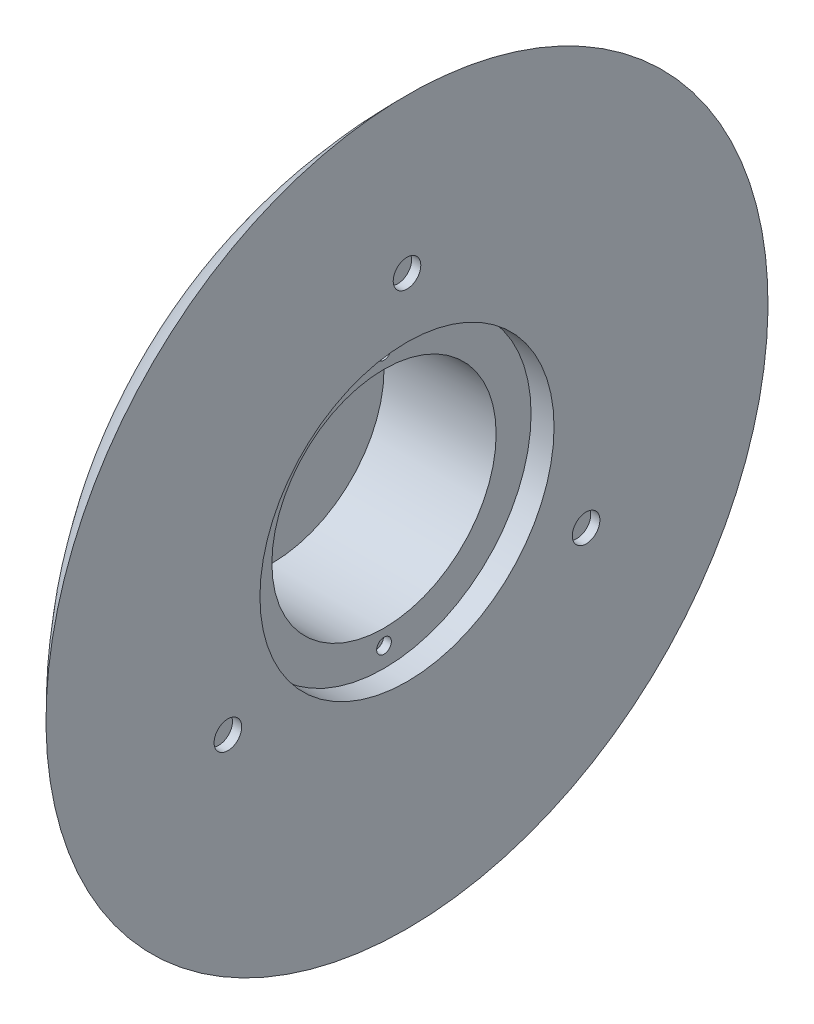
ISO-10303-21;
HEADER;
FILE_DESCRIPTION(('STEP AP214'),'2;1');
FILE_NAME('part.step','',(''),(''),'','','');
FILE_SCHEMA(('AUTOMOTIVE_DESIGN { 1 0 10303 214 1 1 1 1 }'));
ENDSEC;
DATA;
#1=APPLICATION_CONTEXT('core data for automotive mechanical design processes');
#2=APPLICATION_PROTOCOL_DEFINITION('international standard','automotive_design',2000,#1);
#3=PRODUCT_CONTEXT('',#1,'mechanical');
#4=PRODUCT('Part','Part','',(#3));
#5=PRODUCT_RELATED_PRODUCT_CATEGORY('part','',(#4));
#6=PRODUCT_DEFINITION_FORMATION('','',#4);
#7=PRODUCT_DEFINITION_CONTEXT('part definition',#1,'design');
#8=PRODUCT_DEFINITION('design','',#6,#7);
#9=PRODUCT_DEFINITION_SHAPE('','',#8);
#10=(LENGTH_UNIT() NAMED_UNIT(*) SI_UNIT(.MILLI.,.METRE.));
#11=(NAMED_UNIT(*) PLANE_ANGLE_UNIT() SI_UNIT($,.RADIAN.));
#12=(NAMED_UNIT(*) SI_UNIT($,.STERADIAN.) SOLID_ANGLE_UNIT());
#13=UNCERTAINTY_MEASURE_WITH_UNIT(LENGTH_MEASURE(1.E-05),#10,'distance_accuracy_value','');
#14=(GEOMETRIC_REPRESENTATION_CONTEXT(3) GLOBAL_UNCERTAINTY_ASSIGNED_CONTEXT((#13)) GLOBAL_UNIT_ASSIGNED_CONTEXT((#10,
#11,#12)) REPRESENTATION_CONTEXT('',''));
#15=CARTESIAN_POINT('',(0.,0.,0.));
#16=DIRECTION('',(0.,0.,1.));
#17=DIRECTION('',(1.,0.,0.));
#18=AXIS2_PLACEMENT_3D('',#15,#16,#17);
#19=CARTESIAN_POINT('',(-41.,0.,0.));
#20=DIRECTION('',(1.,0.,0.));
#21=DIRECTION('',(0.,1.,0.));
#22=AXIS2_PLACEMENT_3D('',#19,#20,#21);
#23=PLANE('',#22);
#24=CARTESIAN_POINT('',(-41.,0.,0.));
#25=DIRECTION('',(1.,0.,0.));
#26=DIRECTION('',(0.,1.,0.));
#27=AXIS2_PLACEMENT_3D('',#24,#25,#26);
#28=CIRCLE('',#27,12.2);
#29=CARTESIAN_POINT('',(-41.,12.2,0.));
#30=VERTEX_POINT('',#29);
#31=EDGE_CURVE('E53',#30,#30,#28,.F.);
#32=ORIENTED_EDGE('',*,*,#31,.T.);
#33=EDGE_LOOP('',(#32));
#34=FACE_BOUND('',#33,.T.);
#35=CARTESIAN_POINT('',(-41.,0.,0.));
#36=DIRECTION('',(1.,0.,0.));
#37=DIRECTION('',(0.,1.,0.));
#38=AXIS2_PLACEMENT_3D('',#35,#36,#37);
#39=CIRCLE('',#38,16.);
#40=CARTESIAN_POINT('',(-41.,16.,0.));
#41=VERTEX_POINT('',#40);
#42=EDGE_CURVE('E56',#41,#41,#39,.T.);
#43=ORIENTED_EDGE('',*,*,#42,.T.);
#44=EDGE_LOOP('',(#43));
#45=FACE_BOUND('',#44,.T.);
#46=CARTESIAN_POINT('',(-41.,-13.8504291713074,0.));
#47=DIRECTION('',(-1.,0.,0.));
#48=DIRECTION('',(0.,-1.,0.));
#49=AXIS2_PLACEMENT_3D('',#46,#47,#48);
#50=CIRCLE('',#49,0.8);
#51=CARTESIAN_POINT('',(-41.,-14.6504291713074,0.));
#52=VERTEX_POINT('',#51);
#53=EDGE_CURVE('E89',#52,#52,#50,.T.);
#54=ORIENTED_EDGE('',*,*,#53,.T.);
#55=EDGE_LOOP('',(#54));
#56=FACE_BOUND('',#55,.T.);
#57=CARTESIAN_POINT('',(-41.,13.8504291713074,0.));
#58=DIRECTION('',(1.,0.,0.));
#59=DIRECTION('',(0.,1.,0.));
#60=AXIS2_PLACEMENT_3D('',#57,#58,#59);
#61=CIRCLE('',#60,0.8);
#62=CARTESIAN_POINT('',(-41.,14.6504291713074,0.));
#63=VERTEX_POINT('',#62);
#64=EDGE_CURVE('E86',#63,#63,#61,.T.);
#65=ORIENTED_EDGE('',*,*,#64,.F.);
#66=EDGE_LOOP('',(#65));
#67=FACE_BOUND('',#66,.T.);
#68=ADVANCED_FACE('F35',(#34,#45,#56,#67),#23,.T.);
#69=CARTESIAN_POINT('',(-53.2,0.,0.));
#70=DIRECTION('',(1.,0.,0.));
#71=DIRECTION('',(0.,1.,0.));
#72=AXIS2_PLACEMENT_3D('',#69,#70,#71);
#73=CYLINDRICAL_SURFACE('',#72,12.2);
#74=CARTESIAN_POINT('',(-53.2,0.,0.));
#75=DIRECTION('',(1.,0.,0.));
#76=DIRECTION('',(0.,1.,0.));
#77=AXIS2_PLACEMENT_3D('',#74,#75,#76);
#78=CIRCLE('',#77,12.2);
#79=CARTESIAN_POINT('',(-53.2,12.2,0.));
#80=VERTEX_POINT('',#79);
#81=EDGE_CURVE('E50',#80,#80,#78,.T.);
#82=ORIENTED_EDGE('',*,*,#81,.F.);
#83=EDGE_LOOP('',(#82));
#84=FACE_BOUND('',#83,.T.);
#85=ORIENTED_EDGE('',*,*,#31,.F.);
#86=EDGE_LOOP('',(#85));
#87=FACE_BOUND('',#86,.T.);
#88=ADVANCED_FACE('F124',(#84,#87),#73,.F.);
#89=CARTESIAN_POINT('',(-53.2,0.,0.));
#90=DIRECTION('',(1.,0.,0.));
#91=DIRECTION('',(0.,1.,0.));
#92=AXIS2_PLACEMENT_3D('',#89,#90,#91);
#93=PLANE('',#92);
#94=CARTESIAN_POINT('',(-53.2,0.,0.));
#95=DIRECTION('',(1.,0.,0.));
#96=DIRECTION('',(0.,1.,0.));
#97=AXIS2_PLACEMENT_3D('',#94,#95,#96);
#98=CIRCLE('',#97,3.);
#99=CARTESIAN_POINT('',(-53.2,2.99999999999999,0.));
#100=VERTEX_POINT('',#99);
#101=EDGE_CURVE('E61',#100,#100,#98,.T.);
#102=ORIENTED_EDGE('',*,*,#101,.F.);
#103=EDGE_LOOP('',(#102));
#104=FACE_BOUND('',#103,.T.);
#105=ORIENTED_EDGE('',*,*,#81,.T.);
#106=EDGE_LOOP('',(#105));
#107=FACE_BOUND('',#106,.T.);
#108=ADVANCED_FACE('F132',(#104,#107),#93,.T.);
#109=CARTESIAN_POINT('',(-53.9,0.,0.));
#110=DIRECTION('',(1.,0.,0.));
#111=DIRECTION('',(0.,1.,0.));
#112=AXIS2_PLACEMENT_3D('',#109,#110,#111);
#113=CYLINDRICAL_SURFACE('',#112,3.);
#114=CARTESIAN_POINT('',(-53.9,0.,0.));
#115=DIRECTION('',(1.,0.,0.));
#116=DIRECTION('',(0.,1.,0.));
#117=AXIS2_PLACEMENT_3D('',#114,#115,#116);
#118=CIRCLE('',#117,3.);
#119=CARTESIAN_POINT('',(-53.9,2.99999999999999,0.));
#120=VERTEX_POINT('',#119);
#121=EDGE_CURVE('E60',#120,#120,#118,.T.);
#122=ORIENTED_EDGE('',*,*,#121,.F.);
#123=EDGE_LOOP('',(#122));
#124=FACE_BOUND('',#123,.T.);
#125=ORIENTED_EDGE('',*,*,#101,.T.);
#126=EDGE_LOOP('',(#125));
#127=FACE_BOUND('',#126,.T.);
#128=ADVANCED_FACE('F170',(#124,#127),#113,.F.);
#129=CARTESIAN_POINT('',(-53.9,0.,0.));
#130=DIRECTION('',(1.,0.,0.));
#131=DIRECTION('',(0.,1.,0.));
#132=AXIS2_PLACEMENT_3D('',#129,#130,#131);
#133=PLANE('',#132);
#134=ORIENTED_EDGE('',*,*,#121,.T.);
#135=EDGE_LOOP('',(#134));
#136=FACE_BOUND('',#135,.T.);
#137=ADVANCED_FACE('F142',(#136),#133,.T.);
#138=CARTESIAN_POINT('',(-41.,0.,0.));
#139=DIRECTION('',(1.,0.,0.));
#140=DIRECTION('',(0.,1.,0.));
#141=AXIS2_PLACEMENT_3D('',#138,#139,#140);
#142=CYLINDRICAL_SURFACE('',#141,16.);
#143=ORIENTED_EDGE('',*,*,#42,.F.);
#144=EDGE_LOOP('',(#143));
#145=FACE_BOUND('',#144,.T.);
#146=CARTESIAN_POINT('',(-38.5,0.,0.));
#147=DIRECTION('',(1.,0.,0.));
#148=DIRECTION('',(0.,1.,0.));
#149=AXIS2_PLACEMENT_3D('',#146,#147,#148);
#150=CIRCLE('',#149,16.);
#151=CARTESIAN_POINT('',(-38.5,16.,0.));
#152=VERTEX_POINT('',#151);
#153=EDGE_CURVE('E83',#152,#152,#150,.T.);
#154=ORIENTED_EDGE('',*,*,#153,.T.);
#155=EDGE_LOOP('',(#154));
#156=FACE_BOUND('',#155,.T.);
#157=ADVANCED_FACE('F138',(#145,#156),#142,.F.);
#158=CARTESIAN_POINT('',(-39.5,22.5,0.));
#159=DIRECTION('',(1.,0.,0.));
#160=DIRECTION('',(0.,1.,0.));
#161=AXIS2_PLACEMENT_3D('',#158,#159,#160);
#162=PLANE('',#161);
#163=CARTESIAN_POINT('',(-39.5,22.5,0.));
#164=DIRECTION('',(1.,0.,0.));
#165=DIRECTION('',(0.,1.,0.));
#166=AXIS2_PLACEMENT_3D('',#163,#164,#165);
#167=CIRCLE('',#166,1.5);
#168=CARTESIAN_POINT('',(-39.5,24.,0.));
#169=VERTEX_POINT('',#168);
#170=EDGE_CURVE('E75',#169,#169,#167,.T.);
#171=ORIENTED_EDGE('',*,*,#170,.T.);
#172=EDGE_LOOP('',(#171));
#173=FACE_BOUND('',#172,.T.);
#174=ADVANCED_FACE('F141',(#173),#162,.T.);
#175=CARTESIAN_POINT('',(-39.5,-11.2499999999992,-19.4855715851513));
#176=DIRECTION('',(1.,0.,0.));
#177=DIRECTION('',(0.,1.,0.));
#178=AXIS2_PLACEMENT_3D('',#175,#176,#177);
#179=PLANE('',#178);
#180=CARTESIAN_POINT('',(-39.5,-11.2499999999992,-19.4855715851513));
#181=DIRECTION('',(1.,0.,0.));
#182=DIRECTION('',(0.,1.,0.));
#183=AXIS2_PLACEMENT_3D('',#180,#181,#182);
#184=CIRCLE('',#183,1.50000000000123);
#185=CARTESIAN_POINT('',(-39.5,-9.74999999999794,-19.4855715851513));
#186=VERTEX_POINT('',#185);
#187=EDGE_CURVE('E55',#186,#186,#184,.T.);
#188=ORIENTED_EDGE('',*,*,#187,.T.);
#189=EDGE_LOOP('',(#188));
#190=FACE_BOUND('',#189,.T.);
#191=ADVANCED_FACE('F146',(#190),#179,.T.);
#192=CARTESIAN_POINT('',(-39.5,-11.2500000000008,19.4855715851484));
#193=DIRECTION('',(1.,0.,0.));
#194=DIRECTION('',(0.,1.,0.));
#195=AXIS2_PLACEMENT_3D('',#192,#193,#194);
#196=PLANE('',#195);
#197=CARTESIAN_POINT('',(-39.5,-11.2500000000008,19.4855715851484));
#198=DIRECTION('',(1.,0.,0.));
#199=DIRECTION('',(0.,1.,0.));
#200=AXIS2_PLACEMENT_3D('',#197,#198,#199);
#201=CIRCLE('',#200,1.50000000000183);
#202=CARTESIAN_POINT('',(-39.5,-9.74999999999901,19.4855715851484));
#203=VERTEX_POINT('',#202);
#204=EDGE_CURVE('E78',#203,#203,#201,.T.);
#205=ORIENTED_EDGE('',*,*,#204,.T.);
#206=EDGE_LOOP('',(#205));
#207=FACE_BOUND('',#206,.T.);
#208=ADVANCED_FACE('F153',(#207),#196,.T.);
#209=CARTESIAN_POINT('',(0.,0.,0.));
#210=DIRECTION('',(0.,1.,0.));
#211=DIRECTION('',(1.,0.,0.));
#212=AXIS2_PLACEMENT_3D('',#209,#210,#211);
#213=SPHERICAL_SURFACE('',#212,55.);
#214=CARTESIAN_POINT('',(0.,0.,0.));
#215=DIRECTION('',(-1.,0.,0.));
#216=DIRECTION('',(0.,-1.,0.));
#217=AXIS2_PLACEMENT_3D('',#214,#215,#216);
#218=SPHERICAL_SURFACE('',#217,55.);
#219=CARTESIAN_POINT('',(-38.5,0.,0.));
#220=DIRECTION('',(-1.,0.,0.));
#221=DIRECTION('',(0.,-1.,0.));
#222=AXIS2_PLACEMENT_3D('',#219,#220,#221);
#223=CIRCLE('',#222,39.2778563569857);
#224=CARTESIAN_POINT('',(-38.5,-39.2778563569857,0.));
#225=VERTEX_POINT('',#224);
#226=EDGE_CURVE('E46',#225,#225,#223,.F.);
#227=ORIENTED_EDGE('',*,*,#226,.F.);
#228=EDGE_LOOP('',(#227));
#229=FACE_BOUND('',#228,.T.);
#230=ADVANCED_FACE('F37',(#229),#218,.T.);
#231=CARTESIAN_POINT('',(-39.5,22.5,0.));
#232=DIRECTION('',(1.,0.,0.));
#233=DIRECTION('',(0.,1.,0.));
#234=AXIS2_PLACEMENT_3D('',#231,#232,#233);
#235=CYLINDRICAL_SURFACE('',#234,1.5);
#236=ORIENTED_EDGE('',*,*,#170,.F.);
#237=EDGE_LOOP('',(#236));
#238=FACE_BOUND('',#237,.T.);
#239=CARTESIAN_POINT('',(-38.5,22.5,0.));
#240=DIRECTION('',(-1.,0.,0.));
#241=DIRECTION('',(0.,-1.,0.));
#242=AXIS2_PLACEMENT_3D('',#239,#240,#241);
#243=CIRCLE('',#242,1.5);
#244=CARTESIAN_POINT('',(-38.5,21.,0.));
#245=VERTEX_POINT('',#244);
#246=EDGE_CURVE('E64',#245,#245,#243,.T.);
#247=ORIENTED_EDGE('',*,*,#246,.F.);
#248=EDGE_LOOP('',(#247));
#249=FACE_BOUND('',#248,.T.);
#250=ADVANCED_FACE('F148',(#238,#249),#235,.F.);
#251=CARTESIAN_POINT('',(-39.5,-11.2499999999992,-19.4855715851513));
#252=DIRECTION('',(1.,0.,0.));
#253=DIRECTION('',(0.,1.,0.));
#254=AXIS2_PLACEMENT_3D('',#251,#252,#253);
#255=CYLINDRICAL_SURFACE('',#254,1.50000000000123);
#256=ORIENTED_EDGE('',*,*,#187,.F.);
#257=EDGE_LOOP('',(#256));
#258=FACE_BOUND('',#257,.T.);
#259=CARTESIAN_POINT('',(-38.5,-11.2499999999992,-19.4855715851513));
#260=DIRECTION('',(-1.,0.,0.));
#261=DIRECTION('',(0.,-1.,0.));
#262=AXIS2_PLACEMENT_3D('',#259,#260,#261);
#263=CIRCLE('',#262,1.50000000000123);
#264=CARTESIAN_POINT('',(-38.5,-12.7500000000004,-19.4855715851513));
#265=VERTEX_POINT('',#264);
#266=EDGE_CURVE('E69',#265,#265,#263,.T.);
#267=ORIENTED_EDGE('',*,*,#266,.F.);
#268=EDGE_LOOP('',(#267));
#269=FACE_BOUND('',#268,.T.);
#270=ADVANCED_FACE('F151',(#258,#269),#255,.F.);
#271=CARTESIAN_POINT('',(-39.5,-11.2500000000008,19.4855715851484));
#272=DIRECTION('',(1.,0.,0.));
#273=DIRECTION('',(0.,1.,0.));
#274=AXIS2_PLACEMENT_3D('',#271,#272,#273);
#275=CYLINDRICAL_SURFACE('',#274,1.50000000000183);
#276=ORIENTED_EDGE('',*,*,#204,.F.);
#277=EDGE_LOOP('',(#276));
#278=FACE_BOUND('',#277,.T.);
#279=CARTESIAN_POINT('',(-38.5,-11.2500000000008,19.4855715851484));
#280=DIRECTION('',(-1.,0.,0.));
#281=DIRECTION('',(0.,-1.,0.));
#282=AXIS2_PLACEMENT_3D('',#279,#280,#281);
#283=CIRCLE('',#282,1.50000000000183);
#284=CARTESIAN_POINT('',(-38.5,-12.7500000000027,19.4855715851484));
#285=VERTEX_POINT('',#284);
#286=EDGE_CURVE('E72',#285,#285,#283,.T.);
#287=ORIENTED_EDGE('',*,*,#286,.F.);
#288=EDGE_LOOP('',(#287));
#289=FACE_BOUND('',#288,.T.);
#290=ADVANCED_FACE('F157',(#278,#289),#275,.F.);
#291=CARTESIAN_POINT('',(-38.5,0.,-55.));
#292=DIRECTION('',(-1.,0.,0.));
#293=DIRECTION('',(0.,-1.,0.));
#294=AXIS2_PLACEMENT_3D('',#291,#292,#293);
#295=PLANE('',#294);
#296=ORIENTED_EDGE('',*,*,#153,.F.);
#297=EDGE_LOOP('',(#296));
#298=FACE_BOUND('',#297,.T.);
#299=ORIENTED_EDGE('',*,*,#286,.T.);
#300=EDGE_LOOP('',(#299));
#301=FACE_BOUND('',#300,.T.);
#302=ORIENTED_EDGE('',*,*,#266,.T.);
#303=EDGE_LOOP('',(#302));
#304=FACE_BOUND('',#303,.T.);
#305=ORIENTED_EDGE('',*,*,#246,.T.);
#306=EDGE_LOOP('',(#305));
#307=FACE_BOUND('',#306,.T.);
#308=ORIENTED_EDGE('',*,*,#226,.T.);
#309=EDGE_LOOP('',(#308));
#310=FACE_BOUND('',#309,.T.);
#311=ADVANCED_FACE('F160',(#298,#301,#304,#307,#310),#295,.F.);
#312=CARTESIAN_POINT('',(-42.33,-13.8504291713074,0.));
#313=DIRECTION('',(1.,0.,0.));
#314=DIRECTION('',(0.,1.,0.));
#315=AXIS2_PLACEMENT_3D('',#312,#313,#314);
#316=CYLINDRICAL_SURFACE('',#315,0.8);
#317=CARTESIAN_POINT('',(-41.86,-13.8504291713074,0.));
#318=DIRECTION('',(1.,0.,0.));
#319=DIRECTION('',(0.,1.,0.));
#320=AXIS2_PLACEMENT_3D('',#317,#318,#319);
#321=CIRCLE('',#320,0.8);
#322=CARTESIAN_POINT('',(-41.86,-13.0504291713074,0.));
#323=VERTEX_POINT('',#322);
#324=EDGE_CURVE('E10',#323,#323,#321,.T.);
#325=ORIENTED_EDGE('',*,*,#324,.F.);
#326=EDGE_LOOP('',(#325));
#327=FACE_BOUND('',#326,.T.);
#328=ORIENTED_EDGE('',*,*,#53,.F.);
#329=EDGE_LOOP('',(#328));
#330=FACE_BOUND('',#329,.T.);
#331=ADVANCED_FACE('F177',(#327,#330),#316,.F.);
#332=CARTESIAN_POINT('',(-42.33,13.8504291713074,0.));
#333=DIRECTION('',(1.,0.,0.));
#334=DIRECTION('',(0.,1.,0.));
#335=AXIS2_PLACEMENT_3D('',#332,#333,#334);
#336=CYLINDRICAL_SURFACE('',#335,0.8);
#337=CARTESIAN_POINT('',(-41.86,13.8504291713074,0.));
#338=DIRECTION('',(1.,0.,0.));
#339=DIRECTION('',(0.,1.,0.));
#340=AXIS2_PLACEMENT_3D('',#337,#338,#339);
#341=CIRCLE('',#340,0.800000000000001);
#342=CARTESIAN_POINT('',(-41.86,14.6504291713074,0.));
#343=VERTEX_POINT('',#342);
#344=EDGE_CURVE('E97',#343,#343,#341,.T.);
#345=ORIENTED_EDGE('',*,*,#344,.F.);
#346=EDGE_LOOP('',(#345));
#347=FACE_BOUND('',#346,.T.);
#348=ORIENTED_EDGE('',*,*,#64,.T.);
#349=EDGE_LOOP('',(#348));
#350=FACE_BOUND('',#349,.T.);
#351=ADVANCED_FACE('F181',(#347,#350),#336,.F.);
#352=CARTESIAN_POINT('',(-41.86,13.8504291713074,0.));
#353=DIRECTION('',(1.,0.,0.));
#354=DIRECTION('',(0.,1.,0.));
#355=AXIS2_PLACEMENT_3D('',#352,#353,#354);
#356=PLANE('',#355);
#357=ORIENTED_EDGE('',*,*,#344,.T.);
#358=EDGE_LOOP('',(#357));
#359=FACE_BOUND('',#358,.T.);
#360=CARTESIAN_POINT('',(-41.86,13.8504291713074,0.));
#361=DIRECTION('',(1.,0.,0.));
#362=DIRECTION('',(0.,1.,0.));
#363=AXIS2_PLACEMENT_3D('',#360,#361,#362);
#364=CIRCLE('',#363,0.399999999999999);
#365=CARTESIAN_POINT('',(-41.86,14.2504291713074,0.));
#366=VERTEX_POINT('',#365);
#367=EDGE_CURVE('E100',#366,#366,#364,.T.);
#368=ORIENTED_EDGE('',*,*,#367,.F.);
#369=EDGE_LOOP('',(#368));
#370=FACE_BOUND('',#369,.T.);
#371=ADVANCED_FACE('F287',(#359,#370),#356,.T.);
#372=CARTESIAN_POINT('',(-42.51,13.8504291713074,0.));
#373=DIRECTION('',(1.,0.,0.));
#374=DIRECTION('',(0.,1.,0.));
#375=AXIS2_PLACEMENT_3D('',#372,#373,#374);
#376=PLANE('',#375);
#377=CARTESIAN_POINT('',(-42.51,13.8504291713074,0.));
#378=DIRECTION('',(1.,0.,0.));
#379=DIRECTION('',(0.,1.,0.));
#380=AXIS2_PLACEMENT_3D('',#377,#378,#379);
#381=CIRCLE('',#380,0.399999999999999);
#382=CARTESIAN_POINT('',(-42.51,14.2504291713074,0.));
#383=VERTEX_POINT('',#382);
#384=EDGE_CURVE('E92',#383,#383,#381,.T.);
#385=ORIENTED_EDGE('',*,*,#384,.T.);
#386=EDGE_LOOP('',(#385));
#387=FACE_BOUND('',#386,.T.);
#388=ADVANCED_FACE('F119',(#387),#376,.T.);
#389=CARTESIAN_POINT('',(-42.98,13.8504291713074,0.));
#390=DIRECTION('',(1.,0.,0.));
#391=DIRECTION('',(0.,1.,0.));
#392=AXIS2_PLACEMENT_3D('',#389,#390,#391);
#393=CYLINDRICAL_SURFACE('',#392,0.4);
#394=ORIENTED_EDGE('',*,*,#384,.F.);
#395=EDGE_LOOP('',(#394));
#396=FACE_BOUND('',#395,.T.);
#397=ORIENTED_EDGE('',*,*,#367,.T.);
#398=EDGE_LOOP('',(#397));
#399=FACE_BOUND('',#398,.T.);
#400=ADVANCED_FACE('F112',(#396,#399),#393,.F.);
#401=CARTESIAN_POINT('',(-41.86,-13.8504291713074,0.));
#402=DIRECTION('',(1.,0.,0.));
#403=DIRECTION('',(0.,1.,0.));
#404=AXIS2_PLACEMENT_3D('',#401,#402,#403);
#405=PLANE('',#404);
#406=ORIENTED_EDGE('',*,*,#324,.T.);
#407=EDGE_LOOP('',(#406));
#408=FACE_BOUND('',#407,.T.);
#409=CARTESIAN_POINT('',(-41.86,-13.8504291713074,0.));
#410=DIRECTION('',(1.,0.,0.));
#411=DIRECTION('',(0.,1.,0.));
#412=AXIS2_PLACEMENT_3D('',#409,#410,#411);
#413=CIRCLE('',#412,0.399999999999999);
#414=CARTESIAN_POINT('',(-41.86,-13.4504291713074,0.));
#415=VERTEX_POINT('',#414);
#416=EDGE_CURVE('E103',#415,#415,#413,.T.);
#417=ORIENTED_EDGE('',*,*,#416,.F.);
#418=EDGE_LOOP('',(#417));
#419=FACE_BOUND('',#418,.T.);
#420=ADVANCED_FACE('F109',(#408,#419),#405,.T.);
#421=CARTESIAN_POINT('',(-42.51,-13.8504291713074,0.));
#422=DIRECTION('',(1.,0.,0.));
#423=DIRECTION('',(0.,1.,0.));
#424=AXIS2_PLACEMENT_3D('',#421,#422,#423);
#425=PLANE('',#424);
#426=CARTESIAN_POINT('',(-42.51,-13.8504291713074,0.));
#427=DIRECTION('',(1.,0.,0.));
#428=DIRECTION('',(0.,1.,0.));
#429=AXIS2_PLACEMENT_3D('',#426,#427,#428);
#430=CIRCLE('',#429,0.399999999999999);
#431=CARTESIAN_POINT('',(-42.51,-13.4504291713074,0.));
#432=VERTEX_POINT('',#431);
#433=EDGE_CURVE('E42',#432,#432,#430,.T.);
#434=ORIENTED_EDGE('',*,*,#433,.T.);
#435=EDGE_LOOP('',(#434));
#436=FACE_BOUND('',#435,.T.);
#437=ADVANCED_FACE('F111',(#436),#425,.T.);
#438=CARTESIAN_POINT('',(-41.,-13.8504291713074,0.));
#439=DIRECTION('',(-1.,0.,0.));
#440=DIRECTION('',(0.,-1.,0.));
#441=AXIS2_PLACEMENT_3D('',#438,#439,#440);
#442=CYLINDRICAL_SURFACE('',#441,0.399999999999999);
#443=ORIENTED_EDGE('',*,*,#433,.F.);
#444=EDGE_LOOP('',(#443));
#445=FACE_BOUND('',#444,.T.);
#446=ORIENTED_EDGE('',*,*,#416,.T.);
#447=EDGE_LOOP('',(#446));
#448=FACE_BOUND('',#447,.T.);
#449=ADVANCED_FACE('F107',(#445,#448),#442,.F.);
#450=CLOSED_SHELL('',(#68,#88,#108,#128,#137,#157,#174,#191,#208,#230,#250,#270,#290,#311,#331,
#351,#371,#388,#400,#420,#437,#449));
#451=MANIFOLD_SOLID_BREP('B2',#450);
#452=ADVANCED_BREP_SHAPE_REPRESENTATION('',(#18,#451),#14);
#453=SHAPE_DEFINITION_REPRESENTATION(#9,#452);
ENDSEC;
END-ISO-10303-21;
